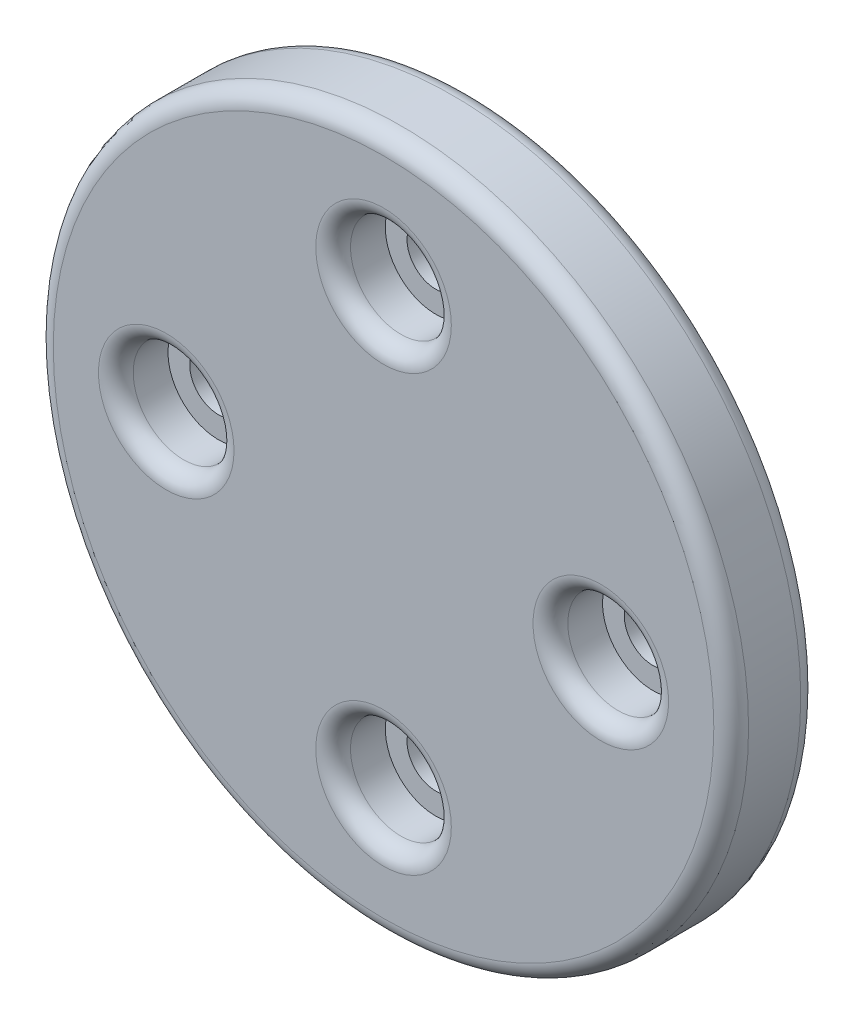
ISO-10303-21;
HEADER;
FILE_DESCRIPTION(('STEP AP214'),'2;1');
FILE_NAME('part.step','',(''),(''),'','','');
FILE_SCHEMA(('AUTOMOTIVE_DESIGN { 1 0 10303 214 1 1 1 1 }'));
ENDSEC;
DATA;
#1=APPLICATION_CONTEXT('core data for automotive mechanical design processes');
#2=APPLICATION_PROTOCOL_DEFINITION('international standard','automotive_design',2000,#1);
#3=PRODUCT_CONTEXT('',#1,'mechanical');
#4=PRODUCT('Part','Part','',(#3));
#5=PRODUCT_RELATED_PRODUCT_CATEGORY('part','',(#4));
#6=PRODUCT_DEFINITION_FORMATION('','',#4);
#7=PRODUCT_DEFINITION_CONTEXT('part definition',#1,'design');
#8=PRODUCT_DEFINITION('design','',#6,#7);
#9=PRODUCT_DEFINITION_SHAPE('','',#8);
#10=(LENGTH_UNIT() NAMED_UNIT(*) SI_UNIT(.MILLI.,.METRE.));
#11=(NAMED_UNIT(*) PLANE_ANGLE_UNIT() SI_UNIT($,.RADIAN.));
#12=(NAMED_UNIT(*) SI_UNIT($,.STERADIAN.) SOLID_ANGLE_UNIT());
#13=UNCERTAINTY_MEASURE_WITH_UNIT(LENGTH_MEASURE(1.E-05),#10,'distance_accuracy_value','');
#14=(GEOMETRIC_REPRESENTATION_CONTEXT(3) GLOBAL_UNCERTAINTY_ASSIGNED_CONTEXT((#13)) GLOBAL_UNIT_ASSIGNED_CONTEXT((#10,
#11,#12)) REPRESENTATION_CONTEXT('',''));
#15=CARTESIAN_POINT('',(0.,0.,0.));
#16=DIRECTION('',(0.,0.,1.));
#17=DIRECTION('',(1.,0.,0.));
#18=AXIS2_PLACEMENT_3D('',#15,#16,#17);
#19=CARTESIAN_POINT('',(12.5,0.,5.));
#20=DIRECTION('',(0.,0.,-1.));
#21=DIRECTION('',(-1.,0.,0.));
#22=AXIS2_PLACEMENT_3D('',#19,#20,#21);
#23=CYLINDRICAL_SURFACE('',#22,1.65);
#24=CARTESIAN_POINT('',(12.5,0.,1.));
#25=DIRECTION('',(0.,0.,1.));
#26=DIRECTION('',(1.,0.,0.));
#27=AXIS2_PLACEMENT_3D('',#24,#25,#26);
#28=CIRCLE('',#27,1.65);
#29=CARTESIAN_POINT('',(14.15,0.,1.));
#30=VERTEX_POINT('',#29);
#31=EDGE_CURVE('E83',#30,#30,#28,.F.);
#32=ORIENTED_EDGE('',*,*,#31,.T.);
#33=EDGE_LOOP('',(#32));
#34=FACE_BOUND('',#33,.T.);
#35=CARTESIAN_POINT('',(12.5,0.,2.));
#36=DIRECTION('',(0.,0.,1.));
#37=DIRECTION('',(1.,0.,0.));
#38=AXIS2_PLACEMENT_3D('',#35,#36,#37);
#39=CIRCLE('',#38,1.65);
#40=CARTESIAN_POINT('',(14.15,0.,2.));
#41=VERTEX_POINT('',#40);
#42=EDGE_CURVE('E107',#41,#41,#39,.T.);
#43=ORIENTED_EDGE('',*,*,#42,.T.);
#44=EDGE_LOOP('',(#43));
#45=FACE_BOUND('',#44,.T.);
#46=ADVANCED_FACE('F39',(#34,#45),#23,.F.);
#47=CARTESIAN_POINT('',(0.,-12.5,5.));
#48=DIRECTION('',(0.,0.,-1.));
#49=DIRECTION('',(-1.,0.,0.));
#50=AXIS2_PLACEMENT_3D('',#47,#48,#49);
#51=CYLINDRICAL_SURFACE('',#50,1.65);
#52=CARTESIAN_POINT('',(0.,-12.5,1.));
#53=DIRECTION('',(0.,0.,1.));
#54=DIRECTION('',(1.,0.,0.));
#55=AXIS2_PLACEMENT_3D('',#52,#53,#54);
#56=CIRCLE('',#55,1.65);
#57=CARTESIAN_POINT('',(1.65,-12.5,1.));
#58=VERTEX_POINT('',#57);
#59=EDGE_CURVE('E80',#58,#58,#56,.F.);
#60=ORIENTED_EDGE('',*,*,#59,.T.);
#61=EDGE_LOOP('',(#60));
#62=FACE_BOUND('',#61,.T.);
#63=CARTESIAN_POINT('',(0.,-12.5,2.));
#64=DIRECTION('',(0.,0.,1.));
#65=DIRECTION('',(1.,0.,0.));
#66=AXIS2_PLACEMENT_3D('',#63,#64,#65);
#67=CIRCLE('',#66,1.65);
#68=CARTESIAN_POINT('',(1.65,-12.5,2.));
#69=VERTEX_POINT('',#68);
#70=EDGE_CURVE('E110',#69,#69,#67,.T.);
#71=ORIENTED_EDGE('',*,*,#70,.T.);
#72=EDGE_LOOP('',(#71));
#73=FACE_BOUND('',#72,.T.);
#74=ADVANCED_FACE('F152',(#62,#73),#51,.F.);
#75=CARTESIAN_POINT('',(-12.5,0.,5.));
#76=DIRECTION('',(0.,0.,-1.));
#77=DIRECTION('',(-1.,0.,0.));
#78=AXIS2_PLACEMENT_3D('',#75,#76,#77);
#79=CYLINDRICAL_SURFACE('',#78,1.65);
#80=CARTESIAN_POINT('',(-12.5,0.,1.));
#81=DIRECTION('',(0.,0.,1.));
#82=DIRECTION('',(1.,0.,0.));
#83=AXIS2_PLACEMENT_3D('',#80,#81,#82);
#84=CIRCLE('',#83,1.65);
#85=CARTESIAN_POINT('',(-10.85,0.,1.));
#86=VERTEX_POINT('',#85);
#87=EDGE_CURVE('E77',#86,#86,#84,.F.);
#88=ORIENTED_EDGE('',*,*,#87,.T.);
#89=EDGE_LOOP('',(#88));
#90=FACE_BOUND('',#89,.T.);
#91=CARTESIAN_POINT('',(-12.5,0.,2.));
#92=DIRECTION('',(0.,0.,1.));
#93=DIRECTION('',(1.,0.,0.));
#94=AXIS2_PLACEMENT_3D('',#91,#92,#93);
#95=CIRCLE('',#94,1.65);
#96=CARTESIAN_POINT('',(-10.85,0.,2.));
#97=VERTEX_POINT('',#96);
#98=EDGE_CURVE('E113',#97,#97,#95,.T.);
#99=ORIENTED_EDGE('',*,*,#98,.T.);
#100=EDGE_LOOP('',(#99));
#101=FACE_BOUND('',#100,.T.);
#102=ADVANCED_FACE('F158',(#90,#101),#79,.F.);
#103=CARTESIAN_POINT('',(0.,12.5,5.));
#104=DIRECTION('',(0.,0.,-1.));
#105=DIRECTION('',(-1.,0.,0.));
#106=AXIS2_PLACEMENT_3D('',#103,#104,#105);
#107=CYLINDRICAL_SURFACE('',#106,1.65);
#108=CARTESIAN_POINT('',(0.,12.5,1.));
#109=DIRECTION('',(0.,0.,1.));
#110=DIRECTION('',(1.,0.,0.));
#111=AXIS2_PLACEMENT_3D('',#108,#109,#110);
#112=CIRCLE('',#111,1.65);
#113=CARTESIAN_POINT('',(1.65,12.5,1.));
#114=VERTEX_POINT('',#113);
#115=EDGE_CURVE('E74',#114,#114,#112,.F.);
#116=ORIENTED_EDGE('',*,*,#115,.T.);
#117=EDGE_LOOP('',(#116));
#118=FACE_BOUND('',#117,.T.);
#119=CARTESIAN_POINT('',(0.,12.5,2.));
#120=DIRECTION('',(0.,0.,1.));
#121=DIRECTION('',(1.,0.,0.));
#122=AXIS2_PLACEMENT_3D('',#119,#120,#121);
#123=CIRCLE('',#122,1.65);
#124=CARTESIAN_POINT('',(1.65,12.5,2.));
#125=VERTEX_POINT('',#124);
#126=EDGE_CURVE('E116',#125,#125,#123,.T.);
#127=ORIENTED_EDGE('',*,*,#126,.T.);
#128=EDGE_LOOP('',(#127));
#129=FACE_BOUND('',#128,.T.);
#130=ADVANCED_FACE('F168',(#118,#129),#107,.F.);
#131=CARTESIAN_POINT('',(0.,0.,5.));
#132=DIRECTION('',(0.,0.,-1.));
#133=DIRECTION('',(-1.,0.,0.));
#134=AXIS2_PLACEMENT_3D('',#131,#132,#133);
#135=CYLINDRICAL_SURFACE('',#134,20.);
#136=CARTESIAN_POINT('',(0.,0.,1.));
#137=DIRECTION('',(0.,0.,1.));
#138=DIRECTION('',(1.,0.,0.));
#139=AXIS2_PLACEMENT_3D('',#136,#137,#138);
#140=CIRCLE('',#139,20.);
#141=CARTESIAN_POINT('',(20.,0.,1.));
#142=VERTEX_POINT('',#141);
#143=EDGE_CURVE('E101',#142,#142,#140,.T.);
#144=ORIENTED_EDGE('',*,*,#143,.T.);
#145=EDGE_LOOP('',(#144));
#146=FACE_BOUND('',#145,.T.);
#147=CARTESIAN_POINT('',(0.,0.,4.));
#148=DIRECTION('',(0.,0.,1.));
#149=DIRECTION('',(1.,0.,0.));
#150=AXIS2_PLACEMENT_3D('',#147,#148,#149);
#151=CIRCLE('',#150,20.);
#152=CARTESIAN_POINT('',(20.,0.,4.));
#153=VERTEX_POINT('',#152);
#154=EDGE_CURVE('E104',#153,#153,#151,.F.);
#155=ORIENTED_EDGE('',*,*,#154,.T.);
#156=EDGE_LOOP('',(#155));
#157=FACE_BOUND('',#156,.T.);
#158=ADVANCED_FACE('F163',(#146,#157),#135,.T.);
#159=CARTESIAN_POINT('',(0.,0.,5.));
#160=DIRECTION('',(0.,0.,1.));
#161=DIRECTION('',(1.,0.,0.));
#162=AXIS2_PLACEMENT_3D('',#159,#160,#161);
#163=PLANE('',#162);
#164=CARTESIAN_POINT('',(0.,0.,5.));
#165=DIRECTION('',(0.,0.,1.));
#166=DIRECTION('',(1.,0.,0.));
#167=AXIS2_PLACEMENT_3D('',#164,#165,#166);
#168=CIRCLE('',#167,19.);
#169=CARTESIAN_POINT('',(19.,0.,5.));
#170=VERTEX_POINT('',#169);
#171=EDGE_CURVE('E59',#170,#170,#168,.T.);
#172=ORIENTED_EDGE('',*,*,#171,.T.);
#173=EDGE_LOOP('',(#172));
#174=FACE_BOUND('',#173,.T.);
#175=CARTESIAN_POINT('',(-12.5,0.,5.));
#176=DIRECTION('',(0.,0.,1.));
#177=DIRECTION('',(1.,0.,0.));
#178=AXIS2_PLACEMENT_3D('',#175,#176,#177);
#179=CIRCLE('',#178,3.9);
#180=CARTESIAN_POINT('',(-8.6,0.,5.));
#181=VERTEX_POINT('',#180);
#182=EDGE_CURVE('E62',#181,#181,#179,.F.);
#183=ORIENTED_EDGE('',*,*,#182,.T.);
#184=EDGE_LOOP('',(#183));
#185=FACE_BOUND('',#184,.T.);
#186=CARTESIAN_POINT('',(0.,-12.5,5.));
#187=DIRECTION('',(0.,0.,1.));
#188=DIRECTION('',(1.,0.,0.));
#189=AXIS2_PLACEMENT_3D('',#186,#187,#188);
#190=CIRCLE('',#189,3.9);
#191=CARTESIAN_POINT('',(3.9,-12.5,5.));
#192=VERTEX_POINT('',#191);
#193=EDGE_CURVE('E65',#192,#192,#190,.F.);
#194=ORIENTED_EDGE('',*,*,#193,.T.);
#195=EDGE_LOOP('',(#194));
#196=FACE_BOUND('',#195,.T.);
#197=CARTESIAN_POINT('',(12.5,0.,5.));
#198=DIRECTION('',(0.,0.,1.));
#199=DIRECTION('',(1.,0.,0.));
#200=AXIS2_PLACEMENT_3D('',#197,#198,#199);
#201=CIRCLE('',#200,3.9);
#202=CARTESIAN_POINT('',(16.4,0.,5.));
#203=VERTEX_POINT('',#202);
#204=EDGE_CURVE('E68',#203,#203,#201,.F.);
#205=ORIENTED_EDGE('',*,*,#204,.T.);
#206=EDGE_LOOP('',(#205));
#207=FACE_BOUND('',#206,.T.);
#208=CARTESIAN_POINT('',(0.,12.5,5.));
#209=DIRECTION('',(0.,0.,1.));
#210=DIRECTION('',(1.,0.,0.));
#211=AXIS2_PLACEMENT_3D('',#208,#209,#210);
#212=CIRCLE('',#211,3.9);
#213=CARTESIAN_POINT('',(3.9,12.5,5.));
#214=VERTEX_POINT('',#213);
#215=EDGE_CURVE('E71',#214,#214,#212,.F.);
#216=ORIENTED_EDGE('',*,*,#215,.T.);
#217=EDGE_LOOP('',(#216));
#218=FACE_BOUND('',#217,.T.);
#219=ADVANCED_FACE('F212',(#174,#185,#196,#207,#218),#163,.T.);
#220=CARTESIAN_POINT('',(0.,0.,0.));
#221=DIRECTION('',(0.,0.,1.));
#222=DIRECTION('',(1.,0.,0.));
#223=AXIS2_PLACEMENT_3D('',#220,#221,#222);
#224=PLANE('',#223);
#225=CARTESIAN_POINT('',(0.,0.,0.));
#226=DIRECTION('',(0.,0.,1.));
#227=DIRECTION('',(1.,0.,0.));
#228=AXIS2_PLACEMENT_3D('',#225,#226,#227);
#229=CIRCLE('',#228,19.);
#230=CARTESIAN_POINT('',(19.,0.,0.));
#231=VERTEX_POINT('',#230);
#232=EDGE_CURVE('E86',#231,#231,#229,.F.);
#233=ORIENTED_EDGE('',*,*,#232,.T.);
#234=EDGE_LOOP('',(#233));
#235=FACE_BOUND('',#234,.T.);
#236=CARTESIAN_POINT('',(12.5,0.,0.));
#237=DIRECTION('',(0.,0.,1.));
#238=DIRECTION('',(1.,0.,0.));
#239=AXIS2_PLACEMENT_3D('',#236,#237,#238);
#240=CIRCLE('',#239,2.65);
#241=CARTESIAN_POINT('',(15.15,0.,0.));
#242=VERTEX_POINT('',#241);
#243=EDGE_CURVE('E89',#242,#242,#240,.T.);
#244=ORIENTED_EDGE('',*,*,#243,.T.);
#245=EDGE_LOOP('',(#244));
#246=FACE_BOUND('',#245,.T.);
#247=CARTESIAN_POINT('',(0.,-12.5,0.));
#248=DIRECTION('',(0.,0.,1.));
#249=DIRECTION('',(1.,0.,0.));
#250=AXIS2_PLACEMENT_3D('',#247,#248,#249);
#251=CIRCLE('',#250,2.65);
#252=CARTESIAN_POINT('',(2.65,-12.5,0.));
#253=VERTEX_POINT('',#252);
#254=EDGE_CURVE('E92',#253,#253,#251,.T.);
#255=ORIENTED_EDGE('',*,*,#254,.T.);
#256=EDGE_LOOP('',(#255));
#257=FACE_BOUND('',#256,.T.);
#258=CARTESIAN_POINT('',(-12.5,0.,0.));
#259=DIRECTION('',(0.,0.,1.));
#260=DIRECTION('',(1.,0.,0.));
#261=AXIS2_PLACEMENT_3D('',#258,#259,#260);
#262=CIRCLE('',#261,2.65);
#263=CARTESIAN_POINT('',(-9.85,0.,0.));
#264=VERTEX_POINT('',#263);
#265=EDGE_CURVE('E95',#264,#264,#262,.T.);
#266=ORIENTED_EDGE('',*,*,#265,.T.);
#267=EDGE_LOOP('',(#266));
#268=FACE_BOUND('',#267,.T.);
#269=CARTESIAN_POINT('',(0.,12.5,0.));
#270=DIRECTION('',(0.,0.,1.));
#271=DIRECTION('',(1.,0.,0.));
#272=AXIS2_PLACEMENT_3D('',#269,#270,#271);
#273=CIRCLE('',#272,2.65);
#274=CARTESIAN_POINT('',(2.65,12.5,0.));
#275=VERTEX_POINT('',#274);
#276=EDGE_CURVE('E98',#275,#275,#273,.T.);
#277=ORIENTED_EDGE('',*,*,#276,.T.);
#278=EDGE_LOOP('',(#277));
#279=FACE_BOUND('',#278,.T.);
#280=ADVANCED_FACE('F215',(#235,#246,#257,#268,#279),#224,.F.);
#281=CARTESIAN_POINT('',(-12.5,0.,2.));
#282=DIRECTION('',(0.,0.,1.));
#283=DIRECTION('',(1.,0.,0.));
#284=AXIS2_PLACEMENT_3D('',#281,#282,#283);
#285=CYLINDRICAL_SURFACE('',#284,2.9);
#286=CARTESIAN_POINT('',(-12.5,0.,4.));
#287=DIRECTION('',(0.,0.,1.));
#288=DIRECTION('',(1.,0.,0.));
#289=AXIS2_PLACEMENT_3D('',#286,#287,#288);
#290=CIRCLE('',#289,2.9);
#291=CARTESIAN_POINT('',(-9.6,0.,4.));
#292=VERTEX_POINT('',#291);
#293=EDGE_CURVE('E54',#292,#292,#290,.T.);
#294=ORIENTED_EDGE('',*,*,#293,.T.);
#295=EDGE_LOOP('',(#294));
#296=FACE_BOUND('',#295,.T.);
#297=CARTESIAN_POINT('',(-12.5,0.,2.));
#298=DIRECTION('',(0.,0.,1.));
#299=DIRECTION('',(1.,0.,0.));
#300=AXIS2_PLACEMENT_3D('',#297,#298,#299);
#301=CIRCLE('',#300,2.9);
#302=CARTESIAN_POINT('',(-9.6,0.,2.));
#303=VERTEX_POINT('',#302);
#304=EDGE_CURVE('E120',#303,#303,#301,.T.);
#305=ORIENTED_EDGE('',*,*,#304,.F.);
#306=EDGE_LOOP('',(#305));
#307=FACE_BOUND('',#306,.T.);
#308=ADVANCED_FACE('F224',(#296,#307),#285,.F.);
#309=CARTESIAN_POINT('',(-12.5,0.,2.));
#310=DIRECTION('',(0.,0.,1.));
#311=DIRECTION('',(1.,0.,0.));
#312=AXIS2_PLACEMENT_3D('',#309,#310,#311);
#313=PLANE('',#312);
#314=ORIENTED_EDGE('',*,*,#98,.F.);
#315=EDGE_LOOP('',(#314));
#316=FACE_BOUND('',#315,.T.);
#317=ORIENTED_EDGE('',*,*,#304,.T.);
#318=EDGE_LOOP('',(#317));
#319=FACE_BOUND('',#318,.T.);
#320=ADVANCED_FACE('F229',(#316,#319),#313,.T.);
#321=CARTESIAN_POINT('',(0.,-12.5,2.));
#322=DIRECTION('',(0.,0.,1.));
#323=DIRECTION('',(1.,0.,0.));
#324=AXIS2_PLACEMENT_3D('',#321,#322,#323);
#325=CYLINDRICAL_SURFACE('',#324,2.9);
#326=CARTESIAN_POINT('',(0.,-12.5,4.));
#327=DIRECTION('',(0.,0.,1.));
#328=DIRECTION('',(1.,0.,0.));
#329=AXIS2_PLACEMENT_3D('',#326,#327,#328);
#330=CIRCLE('',#329,2.9);
#331=CARTESIAN_POINT('',(2.9,-12.5,4.));
#332=VERTEX_POINT('',#331);
#333=EDGE_CURVE('E50',#332,#332,#330,.T.);
#334=ORIENTED_EDGE('',*,*,#333,.T.);
#335=EDGE_LOOP('',(#334));
#336=FACE_BOUND('',#335,.T.);
#337=CARTESIAN_POINT('',(0.,-12.5,2.));
#338=DIRECTION('',(0.,0.,1.));
#339=DIRECTION('',(1.,0.,0.));
#340=AXIS2_PLACEMENT_3D('',#337,#338,#339);
#341=CIRCLE('',#340,2.9);
#342=CARTESIAN_POINT('',(2.9,-12.5,2.));
#343=VERTEX_POINT('',#342);
#344=EDGE_CURVE('E123',#343,#343,#341,.T.);
#345=ORIENTED_EDGE('',*,*,#344,.F.);
#346=EDGE_LOOP('',(#345));
#347=FACE_BOUND('',#346,.T.);
#348=ADVANCED_FACE('F232',(#336,#347),#325,.F.);
#349=CARTESIAN_POINT('',(0.,-12.5,2.));
#350=DIRECTION('',(0.,0.,1.));
#351=DIRECTION('',(1.,0.,0.));
#352=AXIS2_PLACEMENT_3D('',#349,#350,#351);
#353=PLANE('',#352);
#354=ORIENTED_EDGE('',*,*,#70,.F.);
#355=EDGE_LOOP('',(#354));
#356=FACE_BOUND('',#355,.T.);
#357=ORIENTED_EDGE('',*,*,#344,.T.);
#358=EDGE_LOOP('',(#357));
#359=FACE_BOUND('',#358,.T.);
#360=ADVANCED_FACE('F237',(#356,#359),#353,.T.);
#361=CARTESIAN_POINT('',(12.5,0.,2.));
#362=DIRECTION('',(0.,0.,1.));
#363=DIRECTION('',(1.,0.,0.));
#364=AXIS2_PLACEMENT_3D('',#361,#362,#363);
#365=CYLINDRICAL_SURFACE('',#364,2.9);
#366=CARTESIAN_POINT('',(12.5,0.,4.));
#367=DIRECTION('',(0.,0.,1.));
#368=DIRECTION('',(1.,0.,0.));
#369=AXIS2_PLACEMENT_3D('',#366,#367,#368);
#370=CIRCLE('',#369,2.9);
#371=CARTESIAN_POINT('',(15.4,0.,4.));
#372=VERTEX_POINT('',#371);
#373=EDGE_CURVE('E46',#372,#372,#370,.T.);
#374=ORIENTED_EDGE('',*,*,#373,.T.);
#375=EDGE_LOOP('',(#374));
#376=FACE_BOUND('',#375,.T.);
#377=CARTESIAN_POINT('',(12.5,0.,2.));
#378=DIRECTION('',(0.,0.,1.));
#379=DIRECTION('',(1.,0.,0.));
#380=AXIS2_PLACEMENT_3D('',#377,#378,#379);
#381=CIRCLE('',#380,2.9);
#382=CARTESIAN_POINT('',(15.4,0.,2.));
#383=VERTEX_POINT('',#382);
#384=EDGE_CURVE('E126',#383,#383,#381,.T.);
#385=ORIENTED_EDGE('',*,*,#384,.F.);
#386=EDGE_LOOP('',(#385));
#387=FACE_BOUND('',#386,.T.);
#388=ADVANCED_FACE('F147',(#376,#387),#365,.F.);
#389=CARTESIAN_POINT('',(12.5,0.,2.));
#390=DIRECTION('',(0.,0.,1.));
#391=DIRECTION('',(1.,0.,0.));
#392=AXIS2_PLACEMENT_3D('',#389,#390,#391);
#393=PLANE('',#392);
#394=ORIENTED_EDGE('',*,*,#42,.F.);
#395=EDGE_LOOP('',(#394));
#396=FACE_BOUND('',#395,.T.);
#397=ORIENTED_EDGE('',*,*,#384,.T.);
#398=EDGE_LOOP('',(#397));
#399=FACE_BOUND('',#398,.T.);
#400=ADVANCED_FACE('F136',(#396,#399),#393,.T.);
#401=CARTESIAN_POINT('',(0.,12.5,2.));
#402=DIRECTION('',(0.,0.,1.));
#403=DIRECTION('',(1.,0.,0.));
#404=AXIS2_PLACEMENT_3D('',#401,#402,#403);
#405=CYLINDRICAL_SURFACE('',#404,2.9);
#406=CARTESIAN_POINT('',(0.,12.5,4.));
#407=DIRECTION('',(0.,0.,1.));
#408=DIRECTION('',(1.,0.,0.));
#409=AXIS2_PLACEMENT_3D('',#406,#407,#408);
#410=CIRCLE('',#409,2.9);
#411=CARTESIAN_POINT('',(2.9,12.5,4.));
#412=VERTEX_POINT('',#411);
#413=EDGE_CURVE('E10',#412,#412,#410,.T.);
#414=ORIENTED_EDGE('',*,*,#413,.T.);
#415=EDGE_LOOP('',(#414));
#416=FACE_BOUND('',#415,.T.);
#417=CARTESIAN_POINT('',(0.,12.5,2.));
#418=DIRECTION('',(0.,0.,1.));
#419=DIRECTION('',(1.,0.,0.));
#420=AXIS2_PLACEMENT_3D('',#417,#418,#419);
#421=CIRCLE('',#420,2.9);
#422=CARTESIAN_POINT('',(2.9,12.5,2.));
#423=VERTEX_POINT('',#422);
#424=EDGE_CURVE('E119',#423,#423,#421,.T.);
#425=ORIENTED_EDGE('',*,*,#424,.F.);
#426=EDGE_LOOP('',(#425));
#427=FACE_BOUND('',#426,.T.);
#428=ADVANCED_FACE('F134',(#416,#427),#405,.F.);
#429=CARTESIAN_POINT('',(0.,12.5,2.));
#430=DIRECTION('',(0.,0.,1.));
#431=DIRECTION('',(1.,0.,0.));
#432=AXIS2_PLACEMENT_3D('',#429,#430,#431);
#433=PLANE('',#432);
#434=ORIENTED_EDGE('',*,*,#126,.F.);
#435=EDGE_LOOP('',(#434));
#436=FACE_BOUND('',#435,.T.);
#437=ORIENTED_EDGE('',*,*,#424,.T.);
#438=EDGE_LOOP('',(#437));
#439=FACE_BOUND('',#438,.T.);
#440=ADVANCED_FACE('F132',(#436,#439),#433,.T.);
#441=CARTESIAN_POINT('',(0.,0.,1.));
#442=DIRECTION('',(0.,0.,1.));
#443=DIRECTION('',(1.,0.,0.));
#444=AXIS2_PLACEMENT_3D('',#441,#442,#443);
#445=TOROIDAL_SURFACE('',#444,19.,1.);
#446=ORIENTED_EDGE('',*,*,#232,.F.);
#447=EDGE_LOOP('',(#446));
#448=FACE_BOUND('',#447,.T.);
#449=ORIENTED_EDGE('',*,*,#143,.F.);
#450=EDGE_LOOP('',(#449));
#451=FACE_BOUND('',#450,.T.);
#452=ADVANCED_FACE('F143',(#448,#451),#445,.T.);
#453=CARTESIAN_POINT('',(12.5,0.,1.));
#454=DIRECTION('',(0.,0.,1.));
#455=DIRECTION('',(1.,0.,0.));
#456=AXIS2_PLACEMENT_3D('',#453,#454,#455);
#457=TOROIDAL_SURFACE('',#456,2.65,1.);
#458=ORIENTED_EDGE('',*,*,#31,.F.);
#459=EDGE_LOOP('',(#458));
#460=FACE_BOUND('',#459,.T.);
#461=ORIENTED_EDGE('',*,*,#243,.F.);
#462=EDGE_LOOP('',(#461));
#463=FACE_BOUND('',#462,.T.);
#464=ADVANCED_FACE('F174',(#460,#463),#457,.T.);
#465=CARTESIAN_POINT('',(0.,-12.5,1.));
#466=DIRECTION('',(0.,0.,1.));
#467=DIRECTION('',(1.,0.,0.));
#468=AXIS2_PLACEMENT_3D('',#465,#466,#467);
#469=TOROIDAL_SURFACE('',#468,2.65,1.);
#470=ORIENTED_EDGE('',*,*,#59,.F.);
#471=EDGE_LOOP('',(#470));
#472=FACE_BOUND('',#471,.T.);
#473=ORIENTED_EDGE('',*,*,#254,.F.);
#474=EDGE_LOOP('',(#473));
#475=FACE_BOUND('',#474,.T.);
#476=ADVANCED_FACE('F178',(#472,#475),#469,.T.);
#477=CARTESIAN_POINT('',(-12.5,0.,1.));
#478=DIRECTION('',(0.,0.,1.));
#479=DIRECTION('',(1.,0.,0.));
#480=AXIS2_PLACEMENT_3D('',#477,#478,#479);
#481=TOROIDAL_SURFACE('',#480,2.65,1.);
#482=ORIENTED_EDGE('',*,*,#87,.F.);
#483=EDGE_LOOP('',(#482));
#484=FACE_BOUND('',#483,.T.);
#485=ORIENTED_EDGE('',*,*,#265,.F.);
#486=EDGE_LOOP('',(#485));
#487=FACE_BOUND('',#486,.T.);
#488=ADVANCED_FACE('F182',(#484,#487),#481,.T.);
#489=CARTESIAN_POINT('',(0.,12.5,1.));
#490=DIRECTION('',(0.,0.,1.));
#491=DIRECTION('',(1.,0.,0.));
#492=AXIS2_PLACEMENT_3D('',#489,#490,#491);
#493=TOROIDAL_SURFACE('',#492,2.65,1.);
#494=ORIENTED_EDGE('',*,*,#115,.F.);
#495=EDGE_LOOP('',(#494));
#496=FACE_BOUND('',#495,.T.);
#497=ORIENTED_EDGE('',*,*,#276,.F.);
#498=EDGE_LOOP('',(#497));
#499=FACE_BOUND('',#498,.T.);
#500=ADVANCED_FACE('F186',(#496,#499),#493,.T.);
#501=CARTESIAN_POINT('',(0.,0.,4.));
#502=DIRECTION('',(0.,0.,1.));
#503=DIRECTION('',(1.,0.,0.));
#504=AXIS2_PLACEMENT_3D('',#501,#502,#503);
#505=TOROIDAL_SURFACE('',#504,19.,1.);
#506=ORIENTED_EDGE('',*,*,#154,.F.);
#507=EDGE_LOOP('',(#506));
#508=FACE_BOUND('',#507,.T.);
#509=ORIENTED_EDGE('',*,*,#171,.F.);
#510=EDGE_LOOP('',(#509));
#511=FACE_BOUND('',#510,.T.);
#512=ADVANCED_FACE('F190',(#508,#511),#505,.T.);
#513=CARTESIAN_POINT('',(-12.5,0.,4.));
#514=DIRECTION('',(0.,0.,1.));
#515=DIRECTION('',(1.,0.,0.));
#516=AXIS2_PLACEMENT_3D('',#513,#514,#515);
#517=TOROIDAL_SURFACE('',#516,3.9,1.);
#518=ORIENTED_EDGE('',*,*,#182,.F.);
#519=EDGE_LOOP('',(#518));
#520=FACE_BOUND('',#519,.T.);
#521=ORIENTED_EDGE('',*,*,#293,.F.);
#522=EDGE_LOOP('',(#521));
#523=FACE_BOUND('',#522,.T.);
#524=ADVANCED_FACE('F194',(#520,#523),#517,.T.);
#525=CARTESIAN_POINT('',(0.,-12.5,4.));
#526=DIRECTION('',(0.,0.,1.));
#527=DIRECTION('',(1.,0.,0.));
#528=AXIS2_PLACEMENT_3D('',#525,#526,#527);
#529=TOROIDAL_SURFACE('',#528,3.9,1.);
#530=ORIENTED_EDGE('',*,*,#193,.F.);
#531=EDGE_LOOP('',(#530));
#532=FACE_BOUND('',#531,.T.);
#533=ORIENTED_EDGE('',*,*,#333,.F.);
#534=EDGE_LOOP('',(#533));
#535=FACE_BOUND('',#534,.T.);
#536=ADVANCED_FACE('F198',(#532,#535),#529,.T.);
#537=CARTESIAN_POINT('',(12.5,0.,4.));
#538=DIRECTION('',(0.,0.,1.));
#539=DIRECTION('',(1.,0.,0.));
#540=AXIS2_PLACEMENT_3D('',#537,#538,#539);
#541=TOROIDAL_SURFACE('',#540,3.9,1.);
#542=ORIENTED_EDGE('',*,*,#204,.F.);
#543=EDGE_LOOP('',(#542));
#544=FACE_BOUND('',#543,.T.);
#545=ORIENTED_EDGE('',*,*,#373,.F.);
#546=EDGE_LOOP('',(#545));
#547=FACE_BOUND('',#546,.T.);
#548=ADVANCED_FACE('F201',(#544,#547),#541,.T.);
#549=CARTESIAN_POINT('',(0.,12.5,4.));
#550=DIRECTION('',(0.,0.,1.));
#551=DIRECTION('',(1.,0.,0.));
#552=AXIS2_PLACEMENT_3D('',#549,#550,#551);
#553=TOROIDAL_SURFACE('',#552,3.9,1.);
#554=ORIENTED_EDGE('',*,*,#215,.F.);
#555=EDGE_LOOP('',(#554));
#556=FACE_BOUND('',#555,.T.);
#557=ORIENTED_EDGE('',*,*,#413,.F.);
#558=EDGE_LOOP('',(#557));
#559=FACE_BOUND('',#558,.T.);
#560=ADVANCED_FACE('F41',(#556,#559),#553,.T.);
#561=CLOSED_SHELL('',(#46,#74,#102,#130,#158,#219,#280,#308,#320,#348,#360,#388,#400,#428,#440,
#452,#464,#476,#488,#500,#512,#524,#536,#548,#560));
#562=MANIFOLD_SOLID_BREP('B2',#561);
#563=ADVANCED_BREP_SHAPE_REPRESENTATION('',(#18,#562),#14);
#564=SHAPE_DEFINITION_REPRESENTATION(#9,#563);
ENDSEC;
END-ISO-10303-21;
